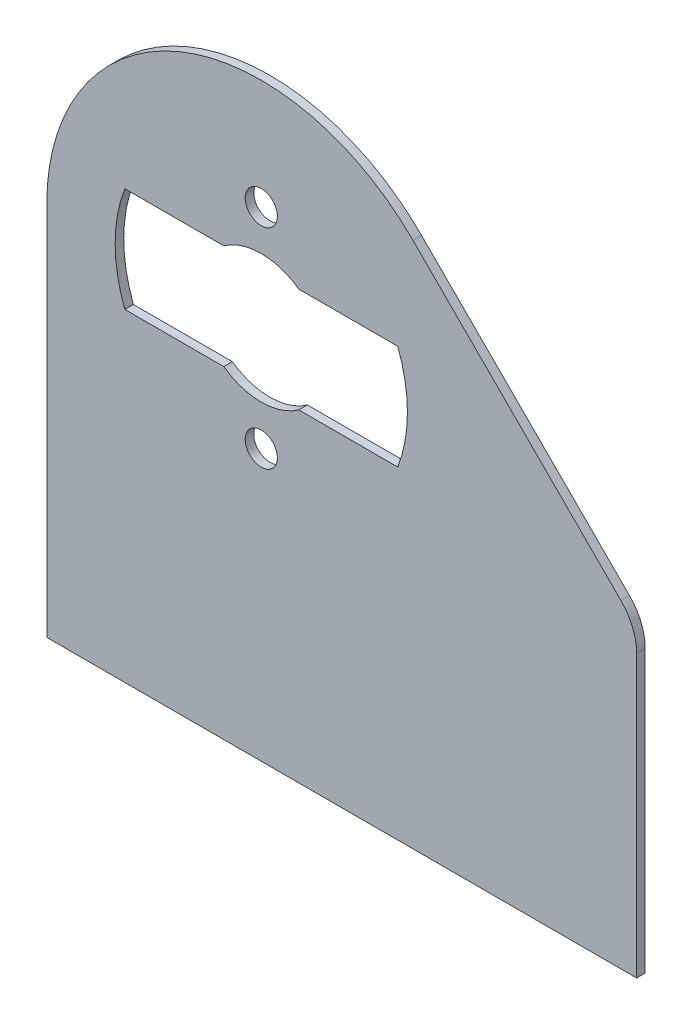
ISO-10303-21;
HEADER;
FILE_DESCRIPTION(('STEP AP214'),'2;1');
FILE_NAME('part.step','',(''),(''),'','','');
FILE_SCHEMA(('AUTOMOTIVE_DESIGN { 1 0 10303 214 1 1 1 1 }'));
ENDSEC;
DATA;
#1=APPLICATION_CONTEXT('core data for automotive mechanical design processes');
#2=APPLICATION_PROTOCOL_DEFINITION('international standard','automotive_design',2000,#1);
#3=PRODUCT_CONTEXT('',#1,'mechanical');
#4=PRODUCT('Part','Part','',(#3));
#5=PRODUCT_RELATED_PRODUCT_CATEGORY('part','',(#4));
#6=PRODUCT_DEFINITION_FORMATION('','',#4);
#7=PRODUCT_DEFINITION_CONTEXT('part definition',#1,'design');
#8=PRODUCT_DEFINITION('design','',#6,#7);
#9=PRODUCT_DEFINITION_SHAPE('','',#8);
#10=(LENGTH_UNIT() NAMED_UNIT(*) SI_UNIT(.MILLI.,.METRE.));
#11=(NAMED_UNIT(*) PLANE_ANGLE_UNIT() SI_UNIT($,.RADIAN.));
#12=(NAMED_UNIT(*) SI_UNIT($,.STERADIAN.) SOLID_ANGLE_UNIT());
#13=UNCERTAINTY_MEASURE_WITH_UNIT(LENGTH_MEASURE(1.E-05),#10,'distance_accuracy_value','');
#14=(GEOMETRIC_REPRESENTATION_CONTEXT(3) GLOBAL_UNCERTAINTY_ASSIGNED_CONTEXT((#13)) GLOBAL_UNIT_ASSIGNED_CONTEXT((#10,
#11,#12)) REPRESENTATION_CONTEXT('',''));
#15=CARTESIAN_POINT('',(0.,0.,0.));
#16=DIRECTION('',(0.,0.,1.));
#17=DIRECTION('',(1.,0.,0.));
#18=AXIS2_PLACEMENT_3D('',#15,#16,#17);
#19=CARTESIAN_POINT('',(28.284271247462,28.2842712474618,1.6));
#20=DIRECTION('',(0.707106781186551,0.707106781186544,0.));
#21=DIRECTION('',(-0.707106781186544,0.707106781186551,0.));
#22=AXIS2_PLACEMENT_3D('',#19,#20,#21);
#23=PLANE('',#22);
#24=DIRECTION('',(0.707106781186544,-0.707106781186551,0.));
#25=VECTOR('',#24,1.);
#26=CARTESIAN_POINT('',(28.284271247462,28.2842712474618,1.6));
#27=LINE('',#26,#25);
#28=CARTESIAN_POINT('',(28.284271247462,28.2842712474617,1.6));
#29=VERTEX_POINT('',#28);
#30=CARTESIAN_POINT('',(67.0710678118655,-10.5025253169421,1.6));
#31=VERTEX_POINT('',#30);
#32=EDGE_CURVE('E377',#29,#31,#27,.T.);
#33=ORIENTED_EDGE('',*,*,#32,.T.);
#34=CARTESIAN_POINT('',(67.0710678118655,-10.5025253169421,4.8));
#35=CARTESIAN_POINT('',(67.0710678118655,-10.5025253169421,3.73333333333333));
#36=CARTESIAN_POINT('',(67.0710678118655,-10.5025253169421,2.66666666666666));
#37=CARTESIAN_POINT('',(67.0710678118655,-10.5025253169421,1.6));
#38=CARTESIAN_POINT('',(67.0710678118655,-10.5025253169421,1.06666666666666));
#39=CARTESIAN_POINT('',(67.0710678118655,-10.5025253169421,0.533333333333329));
#40=CARTESIAN_POINT('',(67.0710678118655,-10.5025253169421,0.));
#41=CARTESIAN_POINT('',(67.0710678118655,-10.5025253169421,-1.06666666666667));
#42=CARTESIAN_POINT('',(67.0710678118655,-10.5025253169421,-2.13333333333334));
#43=CARTESIAN_POINT('',(67.0710678118655,-10.5025253169421,-3.20000000000001));
#44=(BOUNDED_CURVE() B_SPLINE_CURVE(3,(#34,#35,#36,#37,#38,#39,#40,#41,#42,#43),.UNSPECIFIED.,
.F.,.F.) B_SPLINE_CURVE_WITH_KNOTS((4,3,3,4),(-0.0032,0.,0.0016,0.0048),
.UNSPECIFIED.) CURVE() GEOMETRIC_REPRESENTATION_ITEM() RATIONAL_B_SPLINE_CURVE((1.,1.,1.,1.,1.,
1.,1.,1.,1.,1.)) REPRESENTATION_ITEM(''));
#45=CARTESIAN_POINT('',(67.0710678118655,-10.5025253169421,0.));
#46=VERTEX_POINT('',#45);
#47=EDGE_CURVE('E180',#31,#46,#44,.T.);
#48=ORIENTED_EDGE('',*,*,#47,.T.);
#49=DIRECTION('',(0.707106781186544,-0.707106781186551,0.));
#50=VECTOR('',#49,1.);
#51=CARTESIAN_POINT('',(28.284271247462,28.2842712474618,0.));
#52=LINE('',#51,#50);
#53=CARTESIAN_POINT('',(28.284271247462,28.2842712474617,0.));
#54=VERTEX_POINT('',#53);
#55=EDGE_CURVE('E423',#54,#46,#52,.T.);
#56=ORIENTED_EDGE('',*,*,#55,.F.);
#57=DIRECTION('',(0.,0.,-1.));
#58=VECTOR('',#57,1.);
#59=CARTESIAN_POINT('',(28.284271247462,28.2842712474617,1.6));
#60=LINE('',#59,#58);
#61=EDGE_CURVE('E185',#29,#54,#60,.T.);
#62=ORIENTED_EDGE('',*,*,#61,.F.);
#63=EDGE_LOOP('',(#33,#48,#56,#62));
#64=FACE_BOUND('',#63,.T.);
#65=ADVANCED_FACE('F36',(#64),#23,.T.);
#66=CARTESIAN_POINT('',(0.,0.,1.6));
#67=DIRECTION('',(0.,0.,-1.));
#68=DIRECTION('',(-1.,0.,0.));
#69=AXIS2_PLACEMENT_3D('',#66,#67,#68);
#70=CYLINDRICAL_SURFACE('',#69,40.);
#71=CARTESIAN_POINT('',(0.,0.,0.));
#72=DIRECTION('',(0.,0.,1.));
#73=DIRECTION('',(1.,0.,0.));
#74=AXIS2_PLACEMENT_3D('',#71,#72,#73);
#75=CIRCLE('',#74,40.);
#76=CARTESIAN_POINT('',(-40.,0.,0.));
#77=VERTEX_POINT('',#76);
#78=EDGE_CURVE('E425',#54,#77,#75,.T.);
#79=ORIENTED_EDGE('',*,*,#78,.T.);
#80=DIRECTION('',(0.,0.,-1.));
#81=VECTOR('',#80,1.);
#82=CARTESIAN_POINT('',(-40.,0.,1.6));
#83=LINE('',#82,#81);
#84=CARTESIAN_POINT('',(-40.,0.,1.6));
#85=VERTEX_POINT('',#84);
#86=EDGE_CURVE('E437',#85,#77,#83,.T.);
#87=ORIENTED_EDGE('',*,*,#86,.F.);
#88=CARTESIAN_POINT('',(0.,0.,1.6));
#89=DIRECTION('',(0.,0.,1.));
#90=DIRECTION('',(1.,0.,0.));
#91=AXIS2_PLACEMENT_3D('',#88,#89,#90);
#92=CIRCLE('',#91,40.);
#93=EDGE_CURVE('E382',#29,#85,#92,.T.);
#94=ORIENTED_EDGE('',*,*,#93,.F.);
#95=ORIENTED_EDGE('',*,*,#61,.T.);
#96=EDGE_LOOP('',(#79,#87,#94,#95));
#97=FACE_BOUND('',#96,.T.);
#98=ADVANCED_FACE('F213',(#97),#70,.T.);
#99=CARTESIAN_POINT('',(-40.,0.,1.6));
#100=DIRECTION('',(1.,0.,0.));
#101=DIRECTION('',(0.,0.,-1.));
#102=AXIS2_PLACEMENT_3D('',#99,#100,#101);
#103=PLANE('',#102);
#104=DIRECTION('',(0.,-1.,0.));
#105=VECTOR('',#104,1.);
#106=CARTESIAN_POINT('',(-40.,0.,0.));
#107=LINE('',#106,#105);
#108=CARTESIAN_POINT('',(-40.,-70.,0.));
#109=VERTEX_POINT('',#108);
#110=EDGE_CURVE('E428',#77,#109,#107,.T.);
#111=ORIENTED_EDGE('',*,*,#110,.T.);
#112=DIRECTION('',(0.,0.,-1.));
#113=VECTOR('',#112,1.);
#114=CARTESIAN_POINT('',(-40.,-70.,1.6));
#115=LINE('',#114,#113);
#116=CARTESIAN_POINT('',(-40.,-70.,1.6));
#117=VERTEX_POINT('',#116);
#118=EDGE_CURVE('E174',#117,#109,#115,.T.);
#119=ORIENTED_EDGE('',*,*,#118,.F.);
#120=DIRECTION('',(0.,-1.,0.));
#121=VECTOR('',#120,1.);
#122=CARTESIAN_POINT('',(-40.,0.,1.6));
#123=LINE('',#122,#121);
#124=EDGE_CURVE('E385',#85,#117,#123,.T.);
#125=ORIENTED_EDGE('',*,*,#124,.F.);
#126=ORIENTED_EDGE('',*,*,#86,.T.);
#127=EDGE_LOOP('',(#111,#119,#125,#126));
#128=FACE_BOUND('',#127,.T.);
#129=ADVANCED_FACE('F209',(#128),#103,.F.);
#130=CARTESIAN_POINT('',(0.,-70.,1.6));
#131=DIRECTION('',(0.,1.,0.));
#132=DIRECTION('',(0.,0.,1.));
#133=AXIS2_PLACEMENT_3D('',#130,#131,#132);
#134=PLANE('',#133);
#135=DIRECTION('',(1.,0.,0.));
#136=VECTOR('',#135,1.);
#137=CARTESIAN_POINT('',(0.,-70.,0.));
#138=LINE('',#137,#136);
#139=CARTESIAN_POINT('',(70.,-70.,0.));
#140=VERTEX_POINT('',#139);
#141=EDGE_CURVE('E431',#109,#140,#138,.T.);
#142=ORIENTED_EDGE('',*,*,#141,.T.);
#143=DIRECTION('',(0.,0.,-1.));
#144=VECTOR('',#143,1.);
#145=CARTESIAN_POINT('',(70.,-70.,1.6));
#146=LINE('',#145,#144);
#147=CARTESIAN_POINT('',(70.,-70.,1.6));
#148=VERTEX_POINT('',#147);
#149=EDGE_CURVE('E171',#148,#140,#146,.T.);
#150=ORIENTED_EDGE('',*,*,#149,.F.);
#151=DIRECTION('',(1.,0.,0.));
#152=VECTOR('',#151,1.);
#153=CARTESIAN_POINT('',(0.,-70.,1.6));
#154=LINE('',#153,#152);
#155=EDGE_CURVE('E394',#117,#148,#154,.T.);
#156=ORIENTED_EDGE('',*,*,#155,.F.);
#157=ORIENTED_EDGE('',*,*,#118,.T.);
#158=EDGE_LOOP('',(#142,#150,#156,#157));
#159=FACE_BOUND('',#158,.T.);
#160=ADVANCED_FACE('F206',(#159),#134,.F.);
#161=CARTESIAN_POINT('',(0.,9.75,1.6));
#162=DIRECTION('',(0.,1.,0.));
#163=DIRECTION('',(-1.,0.,0.));
#164=AXIS2_PLACEMENT_3D('',#161,#162,#163);
#165=PLANE('',#164);
#166=DIRECTION('',(1.,0.,0.));
#167=VECTOR('',#166,1.);
#168=CARTESIAN_POINT('',(0.,9.75,0.));
#169=LINE('',#168,#167);
#170=CARTESIAN_POINT('',(-25.446021299999,9.75000000000001,0.));
#171=VERTEX_POINT('',#170);
#172=CARTESIAN_POINT('',(-6.99553428981662,9.75,0.));
#173=VERTEX_POINT('',#172);
#174=EDGE_CURVE('E170',#171,#173,#169,.T.);
#175=ORIENTED_EDGE('',*,*,#174,.T.);
#176=DIRECTION('',(0.,0.,-1.));
#177=VECTOR('',#176,1.);
#178=CARTESIAN_POINT('',(-6.99553428981662,9.75,1.6));
#179=LINE('',#178,#177);
#180=CARTESIAN_POINT('',(-6.99553428981662,9.75,1.6));
#181=VERTEX_POINT('',#180);
#182=EDGE_CURVE('E148',#181,#173,#179,.T.);
#183=ORIENTED_EDGE('',*,*,#182,.F.);
#184=DIRECTION('',(1.,0.,0.));
#185=VECTOR('',#184,1.);
#186=CARTESIAN_POINT('',(0.,9.75,1.6));
#187=LINE('',#186,#185);
#188=CARTESIAN_POINT('',(-25.446021299999,9.75000000000001,1.6));
#189=VERTEX_POINT('',#188);
#190=EDGE_CURVE('E155',#189,#181,#187,.T.);
#191=ORIENTED_EDGE('',*,*,#190,.F.);
#192=DIRECTION('',(0.,0.,-1.));
#193=VECTOR('',#192,1.);
#194=CARTESIAN_POINT('',(-25.446021299999,9.75000000000001,1.6));
#195=LINE('',#194,#193);
#196=EDGE_CURVE('E397',#189,#171,#195,.T.);
#197=ORIENTED_EDGE('',*,*,#196,.T.);
#198=EDGE_LOOP('',(#175,#183,#191,#197));
#199=FACE_BOUND('',#198,.T.);
#200=ADVANCED_FACE('F168',(#199),#165,.F.);
#201=CARTESIAN_POINT('',(0.,0.,1.6));
#202=DIRECTION('',(0.,0.,-1.));
#203=DIRECTION('',(-1.,0.,0.));
#204=AXIS2_PLACEMENT_3D('',#201,#202,#203);
#205=CYLINDRICAL_SURFACE('',#204,12.);
#206=CARTESIAN_POINT('',(0.,0.,0.));
#207=DIRECTION('',(0.,0.,1.));
#208=DIRECTION('',(1.,0.,0.));
#209=AXIS2_PLACEMENT_3D('',#206,#207,#208);
#210=CIRCLE('',#209,12.);
#211=CARTESIAN_POINT('',(6.99553428981662,9.75,0.));
#212=VERTEX_POINT('',#211);
#213=EDGE_CURVE('E399',#173,#212,#210,.F.);
#214=ORIENTED_EDGE('',*,*,#213,.T.);
#215=DIRECTION('',(0.,0.,-1.));
#216=VECTOR('',#215,1.);
#217=CARTESIAN_POINT('',(6.99553428981662,9.75,1.6));
#218=LINE('',#217,#216);
#219=CARTESIAN_POINT('',(6.99553428981662,9.75,1.6));
#220=VERTEX_POINT('',#219);
#221=EDGE_CURVE('E151',#220,#212,#218,.T.);
#222=ORIENTED_EDGE('',*,*,#221,.F.);
#223=CARTESIAN_POINT('',(0.,0.,1.6));
#224=DIRECTION('',(0.,0.,1.));
#225=DIRECTION('',(1.,0.,0.));
#226=AXIS2_PLACEMENT_3D('',#223,#224,#225);
#227=CIRCLE('',#226,12.);
#228=EDGE_CURVE('E144',#181,#220,#227,.F.);
#229=ORIENTED_EDGE('',*,*,#228,.F.);
#230=ORIENTED_EDGE('',*,*,#182,.T.);
#231=EDGE_LOOP('',(#214,#222,#229,#230));
#232=FACE_BOUND('',#231,.T.);
#233=ADVANCED_FACE('F146',(#232),#205,.F.);
#234=CARTESIAN_POINT('',(0.,9.75,1.6));
#235=DIRECTION('',(0.,1.,0.));
#236=DIRECTION('',(-1.,0.,0.));
#237=AXIS2_PLACEMENT_3D('',#234,#235,#236);
#238=PLANE('',#237);
#239=DIRECTION('',(1.,0.,0.));
#240=VECTOR('',#239,1.);
#241=CARTESIAN_POINT('',(0.,9.75,0.));
#242=LINE('',#241,#240);
#243=CARTESIAN_POINT('',(25.446021299999,9.74999999999999,0.));
#244=VERTEX_POINT('',#243);
#245=EDGE_CURVE('E401',#212,#244,#242,.T.);
#246=ORIENTED_EDGE('',*,*,#245,.T.);
#247=DIRECTION('',(0.,0.,-1.));
#248=VECTOR('',#247,1.);
#249=CARTESIAN_POINT('',(25.446021299999,9.74999999999999,1.6));
#250=LINE('',#249,#248);
#251=CARTESIAN_POINT('',(25.446021299999,9.74999999999999,1.6));
#252=VERTEX_POINT('',#251);
#253=EDGE_CURVE('E176',#252,#244,#250,.T.);
#254=ORIENTED_EDGE('',*,*,#253,.F.);
#255=DIRECTION('',(1.,0.,0.));
#256=VECTOR('',#255,1.);
#257=CARTESIAN_POINT('',(0.,9.75,1.6));
#258=LINE('',#257,#256);
#259=EDGE_CURVE('E154',#220,#252,#258,.T.);
#260=ORIENTED_EDGE('',*,*,#259,.F.);
#261=ORIENTED_EDGE('',*,*,#221,.T.);
#262=EDGE_LOOP('',(#246,#254,#260,#261));
#263=FACE_BOUND('',#262,.T.);
#264=ADVANCED_FACE('F247',(#263),#238,.F.);
#265=CARTESIAN_POINT('',(0.,0.,1.6));
#266=DIRECTION('',(0.,0.,-1.));
#267=DIRECTION('',(-1.,0.,0.));
#268=AXIS2_PLACEMENT_3D('',#265,#266,#267);
#269=CYLINDRICAL_SURFACE('',#268,27.25);
#270=CARTESIAN_POINT('',(0.,0.,0.));
#271=DIRECTION('',(0.,0.,1.));
#272=DIRECTION('',(1.,0.,0.));
#273=AXIS2_PLACEMENT_3D('',#270,#271,#272);
#274=CIRCLE('',#273,27.25);
#275=CARTESIAN_POINT('',(25.446021299999,-9.75000000000001,0.));
#276=VERTEX_POINT('',#275);
#277=EDGE_CURVE('E403',#244,#276,#274,.F.);
#278=ORIENTED_EDGE('',*,*,#277,.T.);
#279=DIRECTION('',(0.,0.,-1.));
#280=VECTOR('',#279,1.);
#281=CARTESIAN_POINT('',(25.446021299999,-9.75000000000001,1.6));
#282=LINE('',#281,#280);
#283=CARTESIAN_POINT('',(25.446021299999,-9.75000000000001,1.6));
#284=VERTEX_POINT('',#283);
#285=EDGE_CURVE('E448',#284,#276,#282,.T.);
#286=ORIENTED_EDGE('',*,*,#285,.F.);
#287=CARTESIAN_POINT('',(0.,0.,1.6));
#288=DIRECTION('',(0.,0.,1.));
#289=DIRECTION('',(1.,0.,0.));
#290=AXIS2_PLACEMENT_3D('',#287,#288,#289);
#291=CIRCLE('',#290,27.25);
#292=EDGE_CURVE('E454',#252,#284,#291,.F.);
#293=ORIENTED_EDGE('',*,*,#292,.F.);
#294=ORIENTED_EDGE('',*,*,#253,.T.);
#295=EDGE_LOOP('',(#278,#286,#293,#294));
#296=FACE_BOUND('',#295,.T.);
#297=ADVANCED_FACE('F243',(#296),#269,.F.);
#298=CARTESIAN_POINT('',(0.,-9.75,1.6));
#299=DIRECTION('',(0.,1.,0.));
#300=DIRECTION('',(-1.,0.,0.));
#301=AXIS2_PLACEMENT_3D('',#298,#299,#300);
#302=PLANE('',#301);
#303=DIRECTION('',(1.,0.,0.));
#304=VECTOR('',#303,1.);
#305=CARTESIAN_POINT('',(0.,-9.75,0.));
#306=LINE('',#305,#304);
#307=CARTESIAN_POINT('',(6.99553428981661,-9.75000000000001,0.));
#308=VERTEX_POINT('',#307);
#309=EDGE_CURVE('E406',#308,#276,#306,.T.);
#310=ORIENTED_EDGE('',*,*,#309,.F.);
#311=DIRECTION('',(0.,0.,-1.));
#312=VECTOR('',#311,1.);
#313=CARTESIAN_POINT('',(6.99553428981661,-9.75000000000001,1.6));
#314=LINE('',#313,#312);
#315=CARTESIAN_POINT('',(6.99553428981661,-9.75000000000001,1.6));
#316=VERTEX_POINT('',#315);
#317=EDGE_CURVE('E446',#316,#308,#314,.T.);
#318=ORIENTED_EDGE('',*,*,#317,.F.);
#319=DIRECTION('',(1.,0.,0.));
#320=VECTOR('',#319,1.);
#321=CARTESIAN_POINT('',(0.,-9.75,1.6));
#322=LINE('',#321,#320);
#323=EDGE_CURVE('E462',#316,#284,#322,.T.);
#324=ORIENTED_EDGE('',*,*,#323,.T.);
#325=ORIENTED_EDGE('',*,*,#285,.T.);
#326=EDGE_LOOP('',(#310,#318,#324,#325));
#327=FACE_BOUND('',#326,.T.);
#328=ADVANCED_FACE('F239',(#327),#302,.T.);
#329=CARTESIAN_POINT('',(0.,0.,1.6));
#330=DIRECTION('',(0.,0.,-1.));
#331=DIRECTION('',(-1.,0.,0.));
#332=AXIS2_PLACEMENT_3D('',#329,#330,#331);
#333=CYLINDRICAL_SURFACE('',#332,12.);
#334=CARTESIAN_POINT('',(0.,0.,0.));
#335=DIRECTION('',(0.,0.,1.));
#336=DIRECTION('',(1.,0.,0.));
#337=AXIS2_PLACEMENT_3D('',#334,#335,#336);
#338=CIRCLE('',#337,12.);
#339=CARTESIAN_POINT('',(-6.99553428981661,-9.75,0.));
#340=VERTEX_POINT('',#339);
#341=EDGE_CURVE('E409',#308,#340,#338,.F.);
#342=ORIENTED_EDGE('',*,*,#341,.T.);
#343=DIRECTION('',(0.,0.,-1.));
#344=VECTOR('',#343,1.);
#345=CARTESIAN_POINT('',(-6.99553428981661,-9.75,1.6));
#346=LINE('',#345,#344);
#347=CARTESIAN_POINT('',(-6.99553428981661,-9.75,1.6));
#348=VERTEX_POINT('',#347);
#349=EDGE_CURVE('E444',#348,#340,#346,.T.);
#350=ORIENTED_EDGE('',*,*,#349,.F.);
#351=CARTESIAN_POINT('',(0.,0.,1.6));
#352=DIRECTION('',(0.,0.,1.));
#353=DIRECTION('',(1.,0.,0.));
#354=AXIS2_PLACEMENT_3D('',#351,#352,#353);
#355=CIRCLE('',#354,12.);
#356=EDGE_CURVE('E463',#316,#348,#355,.F.);
#357=ORIENTED_EDGE('',*,*,#356,.F.);
#358=ORIENTED_EDGE('',*,*,#317,.T.);
#359=EDGE_LOOP('',(#342,#350,#357,#358));
#360=FACE_BOUND('',#359,.T.);
#361=ADVANCED_FACE('F235',(#360),#333,.F.);
#362=CARTESIAN_POINT('',(0.,-9.75,1.6));
#363=DIRECTION('',(0.,1.,0.));
#364=DIRECTION('',(0.,0.,1.));
#365=AXIS2_PLACEMENT_3D('',#362,#363,#364);
#366=PLANE('',#365);
#367=DIRECTION('',(1.,0.,0.));
#368=VECTOR('',#367,1.);
#369=CARTESIAN_POINT('',(0.,-9.75,0.));
#370=LINE('',#369,#368);
#371=CARTESIAN_POINT('',(-25.446021299999,-9.75,0.));
#372=VERTEX_POINT('',#371);
#373=EDGE_CURVE('E412',#372,#340,#370,.T.);
#374=ORIENTED_EDGE('',*,*,#373,.F.);
#375=DIRECTION('',(0.,0.,-1.));
#376=VECTOR('',#375,1.);
#377=CARTESIAN_POINT('',(-25.446021299999,-9.75,1.6));
#378=LINE('',#377,#376);
#379=CARTESIAN_POINT('',(-25.446021299999,-9.75,1.6));
#380=VERTEX_POINT('',#379);
#381=EDGE_CURVE('E442',#380,#372,#378,.T.);
#382=ORIENTED_EDGE('',*,*,#381,.F.);
#383=DIRECTION('',(1.,0.,0.));
#384=VECTOR('',#383,1.);
#385=CARTESIAN_POINT('',(0.,-9.75,1.6));
#386=LINE('',#385,#384);
#387=EDGE_CURVE('E465',#380,#348,#386,.T.);
#388=ORIENTED_EDGE('',*,*,#387,.T.);
#389=ORIENTED_EDGE('',*,*,#349,.T.);
#390=EDGE_LOOP('',(#374,#382,#388,#389));
#391=FACE_BOUND('',#390,.T.);
#392=ADVANCED_FACE('F225',(#391),#366,.T.);
#393=CARTESIAN_POINT('',(0.,-19.5,1.6));
#394=DIRECTION('',(0.,0.,-1.));
#395=DIRECTION('',(-1.,0.,0.));
#396=AXIS2_PLACEMENT_3D('',#393,#394,#395);
#397=CYLINDRICAL_SURFACE('',#396,3.00000000000001);
#398=CARTESIAN_POINT('',(0.,-19.5,1.6));
#399=DIRECTION('',(0.,0.,1.));
#400=DIRECTION('',(1.,0.,0.));
#401=AXIS2_PLACEMENT_3D('',#398,#399,#400);
#402=CIRCLE('',#401,3.00000000000001);
#403=CARTESIAN_POINT('',(3.00000000000002,-19.5,1.6));
#404=VERTEX_POINT('',#403);
#405=EDGE_CURVE('E383',#404,#404,#402,.F.);
#406=ORIENTED_EDGE('',*,*,#405,.F.);
#407=EDGE_LOOP('',(#406));
#408=FACE_BOUND('',#407,.T.);
#409=CARTESIAN_POINT('',(0.,-19.5,0.));
#410=DIRECTION('',(0.,0.,1.));
#411=DIRECTION('',(1.,0.,0.));
#412=AXIS2_PLACEMENT_3D('',#409,#410,#411);
#413=CIRCLE('',#412,3.00000000000001);
#414=CARTESIAN_POINT('',(3.00000000000002,-19.5,0.));
#415=VERTEX_POINT('',#414);
#416=EDGE_CURVE('E420',#415,#415,#413,.F.);
#417=ORIENTED_EDGE('',*,*,#416,.T.);
#418=EDGE_LOOP('',(#417));
#419=FACE_BOUND('',#418,.T.);
#420=ADVANCED_FACE('F221',(#408,#419),#397,.F.);
#421=CARTESIAN_POINT('',(0.,19.5,1.6));
#422=DIRECTION('',(0.,0.,-1.));
#423=DIRECTION('',(-1.,0.,0.));
#424=AXIS2_PLACEMENT_3D('',#421,#422,#423);
#425=CYLINDRICAL_SURFACE('',#424,3.);
#426=CARTESIAN_POINT('',(0.,19.5,1.6));
#427=DIRECTION('',(0.,0.,1.));
#428=DIRECTION('',(1.,0.,0.));
#429=AXIS2_PLACEMENT_3D('',#426,#427,#428);
#430=CIRCLE('',#429,3.);
#431=CARTESIAN_POINT('',(3.,19.5,1.6));
#432=VERTEX_POINT('',#431);
#433=EDGE_CURVE('E388',#432,#432,#430,.F.);
#434=ORIENTED_EDGE('',*,*,#433,.F.);
#435=EDGE_LOOP('',(#434));
#436=FACE_BOUND('',#435,.T.);
#437=CARTESIAN_POINT('',(0.,19.5,0.));
#438=DIRECTION('',(0.,0.,1.));
#439=DIRECTION('',(1.,0.,0.));
#440=AXIS2_PLACEMENT_3D('',#437,#438,#439);
#441=CIRCLE('',#440,3.);
#442=CARTESIAN_POINT('',(3.,19.5,0.));
#443=VERTEX_POINT('',#442);
#444=EDGE_CURVE('E417',#443,#443,#441,.F.);
#445=ORIENTED_EDGE('',*,*,#444,.T.);
#446=EDGE_LOOP('',(#445));
#447=FACE_BOUND('',#446,.T.);
#448=ADVANCED_FACE('F224',(#436,#447),#425,.F.);
#449=CARTESIAN_POINT('',(0.,0.,1.6));
#450=DIRECTION('',(0.,0.,-1.));
#451=DIRECTION('',(-1.,0.,0.));
#452=AXIS2_PLACEMENT_3D('',#449,#450,#451);
#453=CYLINDRICAL_SURFACE('',#452,27.25);
#454=CARTESIAN_POINT('',(0.,0.,0.));
#455=DIRECTION('',(0.,0.,1.));
#456=DIRECTION('',(1.,0.,0.));
#457=AXIS2_PLACEMENT_3D('',#454,#455,#456);
#458=CIRCLE('',#457,27.25);
#459=EDGE_CURVE('E415',#372,#171,#458,.F.);
#460=ORIENTED_EDGE('',*,*,#459,.T.);
#461=ORIENTED_EDGE('',*,*,#196,.F.);
#462=CARTESIAN_POINT('',(0.,0.,1.6));
#463=DIRECTION('',(0.,0.,1.));
#464=DIRECTION('',(1.,0.,0.));
#465=AXIS2_PLACEMENT_3D('',#462,#463,#464);
#466=CIRCLE('',#465,27.25);
#467=EDGE_CURVE('E162',#380,#189,#466,.F.);
#468=ORIENTED_EDGE('',*,*,#467,.F.);
#469=ORIENTED_EDGE('',*,*,#381,.T.);
#470=EDGE_LOOP('',(#460,#461,#468,#469));
#471=FACE_BOUND('',#470,.T.);
#472=ADVANCED_FACE('F205',(#471),#453,.F.);
#473=CARTESIAN_POINT('',(70.,0.,1.6));
#474=DIRECTION('',(-1.,0.,0.));
#475=DIRECTION('',(0.,0.,1.));
#476=AXIS2_PLACEMENT_3D('',#473,#474,#475);
#477=PLANE('',#476);
#478=DIRECTION('',(0.,1.,0.));
#479=VECTOR('',#478,1.);
#480=CARTESIAN_POINT('',(70.,0.,0.));
#481=LINE('',#480,#479);
#482=CARTESIAN_POINT('',(70.,-17.5735931288075,0.));
#483=VERTEX_POINT('',#482);
#484=EDGE_CURVE('E166',#140,#483,#481,.T.);
#485=ORIENTED_EDGE('',*,*,#484,.T.);
#486=CARTESIAN_POINT('',(70.,-17.5735931288075,4.80000000000001));
#487=CARTESIAN_POINT('',(70.,-17.5735931288075,3.73333333333334));
#488=CARTESIAN_POINT('',(70.,-17.5735931288075,2.66666666666667));
#489=CARTESIAN_POINT('',(70.,-17.5735931288075,1.60000000000001));
#490=CARTESIAN_POINT('',(70.,-17.5735931288075,1.06666666666667));
#491=CARTESIAN_POINT('',(70.,-17.5735931288075,0.53333333333334));
#492=CARTESIAN_POINT('',(70.,-17.5735931288075,0.));
#493=CARTESIAN_POINT('',(70.,-17.5735931288075,-1.06666666666666));
#494=CARTESIAN_POINT('',(70.,-17.5735931288075,-2.13333333333333));
#495=CARTESIAN_POINT('',(70.,-17.5735931288075,-3.19999999999999));
#496=(BOUNDED_CURVE() B_SPLINE_CURVE(3,(#486,#487,#488,#489,#490,#491,#492,#493,#494,#495),
.UNSPECIFIED.,.F.,.F.) B_SPLINE_CURVE_WITH_KNOTS((4,3,3,4),(-0.0032,0.,0.0016,0.0048),
.UNSPECIFIED.) CURVE() GEOMETRIC_REPRESENTATION_ITEM() RATIONAL_B_SPLINE_CURVE((1.,1.,1.,1.,1.,
1.,1.,1.,1.,1.)) REPRESENTATION_ITEM(''));
#497=CARTESIAN_POINT('',(70.,-17.5735931288075,1.6));
#498=VERTEX_POINT('',#497);
#499=EDGE_CURVE('E53',#483,#498,#496,.F.);
#500=ORIENTED_EDGE('',*,*,#499,.T.);
#501=DIRECTION('',(0.,1.,0.));
#502=VECTOR('',#501,1.);
#503=CARTESIAN_POINT('',(70.,0.,1.6));
#504=LINE('',#503,#502);
#505=EDGE_CURVE('E379',#148,#498,#504,.T.);
#506=ORIENTED_EDGE('',*,*,#505,.F.);
#507=ORIENTED_EDGE('',*,*,#149,.T.);
#508=EDGE_LOOP('',(#485,#500,#506,#507));
#509=FACE_BOUND('',#508,.T.);
#510=ADVANCED_FACE('F202',(#509),#477,.F.);
#511=CARTESIAN_POINT('',(0.,0.,1.6));
#512=DIRECTION('',(0.,0.,1.));
#513=DIRECTION('',(1.,0.,0.));
#514=AXIS2_PLACEMENT_3D('',#511,#512,#513);
#515=PLANE('',#514);
#516=ORIENTED_EDGE('',*,*,#190,.T.);
#517=ORIENTED_EDGE('',*,*,#228,.T.);
#518=ORIENTED_EDGE('',*,*,#259,.T.);
#519=ORIENTED_EDGE('',*,*,#292,.T.);
#520=ORIENTED_EDGE('',*,*,#323,.F.);
#521=ORIENTED_EDGE('',*,*,#356,.T.);
#522=ORIENTED_EDGE('',*,*,#387,.F.);
#523=ORIENTED_EDGE('',*,*,#467,.T.);
#524=EDGE_LOOP('',(#516,#517,#518,#519,#520,#521,#522,#523));
#525=FACE_BOUND('',#524,.T.);
#526=ORIENTED_EDGE('',*,*,#433,.T.);
#527=EDGE_LOOP('',(#526));
#528=FACE_BOUND('',#527,.T.);
#529=ORIENTED_EDGE('',*,*,#405,.T.);
#530=EDGE_LOOP('',(#529));
#531=FACE_BOUND('',#530,.T.);
#532=ORIENTED_EDGE('',*,*,#505,.T.);
#533=CARTESIAN_POINT('',(70.,-17.5735931288075,1.60000000000001));
#534=CARTESIAN_POINT('',(69.9999990653511,-17.4059096197926,1.6));
#535=CARTESIAN_POINT('',(69.9957811792507,-17.2382585899023,1.6));
#536=CARTESIAN_POINT('',(69.9789242898756,-16.9033723866466,1.6));
#537=CARTESIAN_POINT('',(69.9662848817412,-16.7361372336622,1.6));
#538=CARTESIAN_POINT('',(69.9157125092938,-16.2351935853852,1.6));
#539=CARTESIAN_POINT('',(69.865125437786,-15.9026633863546,1.60000000000001));
#540=CARTESIAN_POINT('',(69.7417492827736,-15.2982036741197,1.60000000000001));
#541=CARTESIAN_POINT('',(69.6739281557511,-15.0252374018196,1.6));
#542=CARTESIAN_POINT('',(69.5155126908115,-14.4858722073117,1.6));
#543=CARTESIAN_POINT('',(69.4249108942755,-14.2194754674639,1.6));
#544=CARTESIAN_POINT('',(69.2215416624229,-13.6951588856222,1.6));
#545=CARTESIAN_POINT('',(69.108765901144,-13.4372422703675,1.6));
#546=CARTESIAN_POINT('',(68.8619477351598,-12.9319344536836,1.6));
#547=CARTESIAN_POINT('',(68.7279108260872,-12.6845405532165,1.6));
#548=CARTESIAN_POINT('',(68.3725664075955,-12.0900640016083,1.6));
#549=CARTESIAN_POINT('',(68.1395779214058,-11.74983077266,1.6));
#550=CARTESIAN_POINT('',(67.7604064307896,-11.2634096326642,1.6));
#551=CARTESIAN_POINT('',(67.6291458149171,-11.1053354108952,1.6));
#552=CARTESIAN_POINT('',(67.3571210416072,-10.7975386452452,1.6));
#553=CARTESIAN_POINT('',(67.2163552525105,-10.6478175433588,1.6));
#554=CARTESIAN_POINT('',(67.0710678118655,-10.5025253169421,1.59999999999999));
#555=B_SPLINE_CURVE_WITH_KNOTS('',3,(#533,#534,#535,#536,#537,#538,#539,#540,#541,#542,#543,
#544,#545,#546,#547,#548,#549,#550,#551,#552,#553,#554),.UNSPECIFIED.,.F.,.F.,(4,2,2,2,2,2,2,2,
2,2,4),(0.,0.502932656144549,1.00588949222249,2.01304699549064,2.85590820597295,
3.69904573781206,4.54250046072479,5.38573751963975,6.61920903969109,7.23528713905864,
7.85147126465732),.UNSPECIFIED.);
#556=EDGE_CURVE('E11',#498,#31,#555,.T.);
#557=ORIENTED_EDGE('',*,*,#556,.T.);
#558=ORIENTED_EDGE('',*,*,#32,.F.);
#559=ORIENTED_EDGE('',*,*,#93,.T.);
#560=ORIENTED_EDGE('',*,*,#124,.T.);
#561=ORIENTED_EDGE('',*,*,#155,.T.);
#562=EDGE_LOOP('',(#532,#557,#558,#559,#560,#561));
#563=FACE_BOUND('',#562,.T.);
#564=ADVANCED_FACE('F158',(#525,#528,#531,#563),#515,.T.);
#565=CARTESIAN_POINT('',(0.,0.,0.));
#566=DIRECTION('',(0.,0.,1.));
#567=DIRECTION('',(1.,0.,0.));
#568=AXIS2_PLACEMENT_3D('',#565,#566,#567);
#569=PLANE('',#568);
#570=ORIENTED_EDGE('',*,*,#174,.F.);
#571=ORIENTED_EDGE('',*,*,#459,.F.);
#572=ORIENTED_EDGE('',*,*,#373,.T.);
#573=ORIENTED_EDGE('',*,*,#341,.F.);
#574=ORIENTED_EDGE('',*,*,#309,.T.);
#575=ORIENTED_EDGE('',*,*,#277,.F.);
#576=ORIENTED_EDGE('',*,*,#245,.F.);
#577=ORIENTED_EDGE('',*,*,#213,.F.);
#578=EDGE_LOOP('',(#570,#571,#572,#573,#574,#575,#576,#577));
#579=FACE_BOUND('',#578,.T.);
#580=ORIENTED_EDGE('',*,*,#444,.F.);
#581=EDGE_LOOP('',(#580));
#582=FACE_BOUND('',#581,.T.);
#583=ORIENTED_EDGE('',*,*,#416,.F.);
#584=EDGE_LOOP('',(#583));
#585=FACE_BOUND('',#584,.T.);
#586=ORIENTED_EDGE('',*,*,#55,.T.);
#587=CARTESIAN_POINT('',(67.0710678118655,-10.5025253169421,0.));
#588=CARTESIAN_POINT('',(67.1896372972866,-10.6210961241563,0.));
#589=CARTESIAN_POINT('',(67.305201981531,-10.7426258001285,0.));
#590=CARTESIAN_POINT('',(67.5300826659921,-10.9913457261632,0.));
#591=CARTESIAN_POINT('',(67.6393983655181,-11.1185362480933,0.));
#592=CARTESIAN_POINT('',(67.9578589487089,-11.5085169662805,0.));
#593=CARTESIAN_POINT('',(68.1572228460892,-11.779421786268,0.));
#594=CARTESIAN_POINT('',(68.4974002917186,-12.2940794635893,0.));
#595=CARTESIAN_POINT('',(68.6424598150718,-12.5350525445933,0.));
#596=CARTESIAN_POINT('',(68.9118319521408,-13.0284579806694,0.));
#597=CARTESIAN_POINT('',(69.0361377486548,-13.28089406662,0.));
#598=CARTESIAN_POINT('',(69.263081796236,-13.7954456400565,0.));
#599=CARTESIAN_POINT('',(69.3657118783095,-14.0575647332376,0.));
#600=CARTESIAN_POINT('',(69.5484916631858,-14.5893981158889,0.));
#601=CARTESIAN_POINT('',(69.6286471604958,-14.8591104278679,0.));
#602=CARTESIAN_POINT('',(69.797739113422,-15.5307352767386,0.));
#603=CARTESIAN_POINT('',(69.8735725982733,-15.9360642386361,0.));
#604=CARTESIAN_POINT('',(69.9494095526294,-16.548130657487,0.));
#605=CARTESIAN_POINT('',(69.9683696351869,-16.7527212832168,0.));
#606=CARTESIAN_POINT('',(69.9936642535472,-17.1627170252934,0.));
#607=CARTESIAN_POINT('',(69.9999966159483,-17.3681222757533,0.));
#608=CARTESIAN_POINT('',(70.,-17.5735931288075,0.));
#609=B_SPLINE_CURVE_WITH_KNOTS('',3,(#587,#588,#589,#590,#591,#592,#593,#594,#595,#596,#597,
#598,#599,#600,#601,#602,#603,#604,#605,#606,#607,#608),.UNSPECIFIED.,.F.,.F.,(4,2,2,2,2,2,2,2,
2,2,4),(0.,0.502932656144539,1.00588949222248,2.01304699549061,2.85590820597293,
3.69904573781206,4.5425004607248,5.38573751963977,6.61920903969112,7.23528713905865,
7.85147126465732),.UNSPECIFIED.);
#610=EDGE_CURVE('E67',#46,#483,#609,.T.);
#611=ORIENTED_EDGE('',*,*,#610,.T.);
#612=ORIENTED_EDGE('',*,*,#484,.F.);
#613=ORIENTED_EDGE('',*,*,#141,.F.);
#614=ORIENTED_EDGE('',*,*,#110,.F.);
#615=ORIENTED_EDGE('',*,*,#78,.F.);
#616=EDGE_LOOP('',(#586,#611,#612,#613,#614,#615));
#617=FACE_BOUND('',#616,.T.);
#618=ADVANCED_FACE('F196',(#579,#582,#585,#617),#569,.F.);
#619=CARTESIAN_POINT('',(67.0710678118655,-10.5025253169421,1.92000000000001));
#620=CARTESIAN_POINT('',(67.0710678118655,-10.5025253169421,1.81333333333334));
#621=CARTESIAN_POINT('',(67.0710678118655,-10.5025253169421,1.70666666666667));
#622=CARTESIAN_POINT('',(67.0710678118655,-10.5025253169421,1.6));
#623=CARTESIAN_POINT('',(67.0710678118655,-10.5025253169421,1.06666666666666));
#624=CARTESIAN_POINT('',(67.0710678118655,-10.5025253169421,0.533333333333329));
#625=CARTESIAN_POINT('',(67.0710678118655,-10.5025253169421,0.));
#626=CARTESIAN_POINT('',(67.0710678118655,-10.5025253169421,-0.10666666666668));
#627=CARTESIAN_POINT('',(67.0710678118655,-10.5025253169421,-0.213333333333355));
#628=CARTESIAN_POINT('',(67.0710678118655,-10.5025253169421,-0.320000000000031));
#629=CARTESIAN_POINT('',(70.,-13.4314575050766,1.92000000000002));
#630=CARTESIAN_POINT('',(70.,-13.4314575050766,1.81333333333334));
#631=CARTESIAN_POINT('',(70.,-13.4314575050766,1.70666666666667));
#632=CARTESIAN_POINT('',(70.,-13.4314575050766,1.6));
#633=CARTESIAN_POINT('',(70.,-13.4314575050766,1.06666666666667));
#634=CARTESIAN_POINT('',(70.,-13.4314575050766,0.533333333333334));
#635=CARTESIAN_POINT('',(70.,-13.4314575050766,0.));
#636=CARTESIAN_POINT('',(70.,-13.4314575050766,-0.106666666666675));
#637=CARTESIAN_POINT('',(70.,-13.4314575050766,-0.21333333333335));
#638=CARTESIAN_POINT('',(70.,-13.4314575050766,-0.320000000000026));
#639=CARTESIAN_POINT('',(70.,-17.5735931288075,1.92000000000002));
#640=CARTESIAN_POINT('',(70.,-17.5735931288075,1.81333333333335));
#641=CARTESIAN_POINT('',(70.,-17.5735931288075,1.70666666666668));
#642=CARTESIAN_POINT('',(70.,-17.5735931288075,1.60000000000001));
#643=CARTESIAN_POINT('',(70.,-17.5735931288075,1.06666666666667));
#644=CARTESIAN_POINT('',(70.,-17.5735931288075,0.53333333333334));
#645=CARTESIAN_POINT('',(70.,-17.5735931288075,0.));
#646=CARTESIAN_POINT('',(70.,-17.5735931288075,-0.106666666666668));
#647=CARTESIAN_POINT('',(70.,-17.5735931288075,-0.213333333333344));
#648=CARTESIAN_POINT('',(70.,-17.5735931288075,-0.320000000000019));
#649=(BOUNDED_SURFACE() B_SPLINE_SURFACE(2,3,((#619,#620,#621,#622,#623,#624,#625,#626,#627,
#628),(#629,#630,#631,#632,#633,#634,#635,#636,#637,#638),(#639,#640,#641,#642,#643,#644,#645,
#646,#647,#648)),.UNSPECIFIED.,.F.,.F.,.F.) B_SPLINE_SURFACE_WITH_KNOTS((3,3),(4,3,3,4),(0.,1.),
(-0.000320000000000015,0.,0.0016,0.00192000000000003),
.UNSPECIFIED.) GEOMETRIC_REPRESENTATION_ITEM() RATIONAL_B_SPLINE_SURFACE(((1.,1.,1.,1.,1.,1.,1.,
1.,1.,1.),(0.923879532511288,0.923879532511288,0.923879532511288,0.923879532511288,
0.923879532511288,0.923879532511288,0.923879532511288,0.923879532511288,0.923879532511288,
0.923879532511288),(1.,1.,1.,1.,1.,1.,1.,1.,1.,1.))) REPRESENTATION_ITEM('') SURFACE());
#650=ORIENTED_EDGE('',*,*,#556,.F.);
#651=ORIENTED_EDGE('',*,*,#499,.F.);
#652=ORIENTED_EDGE('',*,*,#610,.F.);
#653=ORIENTED_EDGE('',*,*,#47,.F.);
#654=EDGE_LOOP('',(#650,#651,#652,#653));
#655=FACE_BOUND('',#654,.T.);
#656=ADVANCED_FACE('F39',(#655),#649,.T.);
#657=CLOSED_SHELL('',(#65,#98,#129,#160,#200,#233,#264,#297,#328,#361,#392,#420,#448,#472,#510,
#564,#618,#656));
#658=MANIFOLD_SOLID_BREP('B2',#657);
#659=ADVANCED_BREP_SHAPE_REPRESENTATION('',(#18,#658),#14);
#660=SHAPE_DEFINITION_REPRESENTATION(#9,#659);
ENDSEC;
END-ISO-10303-21;
